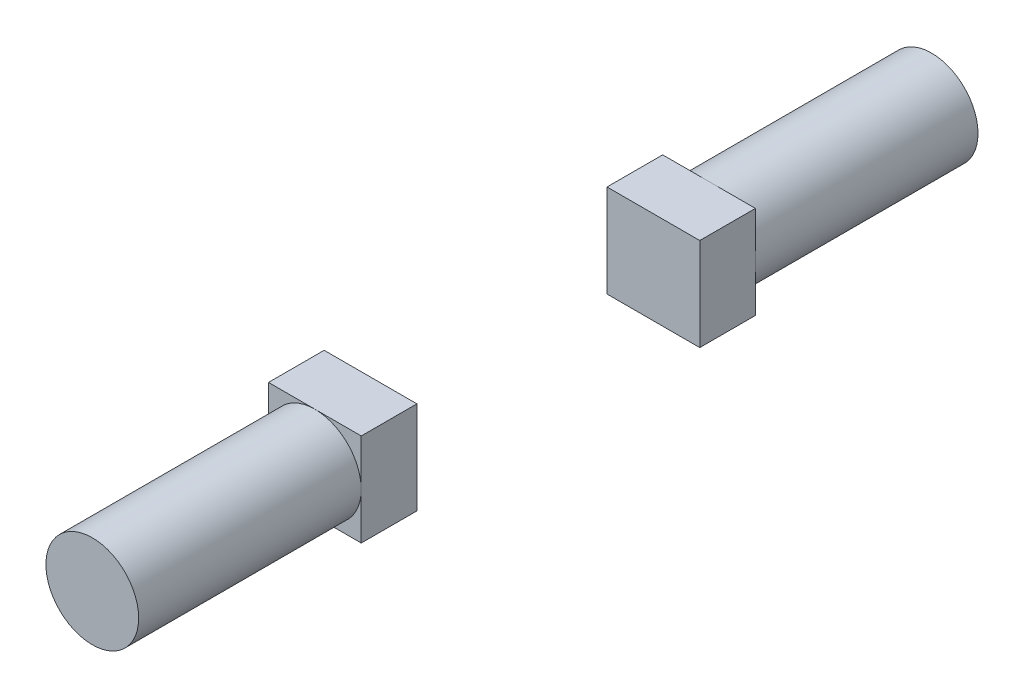
ISO-10303-21;
HEADER;
FILE_DESCRIPTION(('STEP AP214'),'2;1');
FILE_NAME('part.step','',(''),(''),'','','');
FILE_SCHEMA(('AUTOMOTIVE_DESIGN { 1 0 10303 214 1 1 1 1 }'));
ENDSEC;
DATA;
#1=APPLICATION_CONTEXT('core data for automotive mechanical design processes');
#2=APPLICATION_PROTOCOL_DEFINITION('international standard','automotive_design',2000,#1);
#3=PRODUCT_CONTEXT('',#1,'mechanical');
#4=PRODUCT('Part','Part','',(#3));
#5=PRODUCT_RELATED_PRODUCT_CATEGORY('part','',(#4));
#6=PRODUCT_DEFINITION_FORMATION('','',#4);
#7=PRODUCT_DEFINITION_CONTEXT('part definition',#1,'design');
#8=PRODUCT_DEFINITION('design','',#6,#7);
#9=PRODUCT_DEFINITION_SHAPE('','',#8);
#10=(LENGTH_UNIT() NAMED_UNIT(*) SI_UNIT(.MILLI.,.METRE.));
#11=(NAMED_UNIT(*) PLANE_ANGLE_UNIT() SI_UNIT($,.RADIAN.));
#12=(NAMED_UNIT(*) SI_UNIT($,.STERADIAN.) SOLID_ANGLE_UNIT());
#13=UNCERTAINTY_MEASURE_WITH_UNIT(LENGTH_MEASURE(1.E-05),#10,'distance_accuracy_value','');
#14=(GEOMETRIC_REPRESENTATION_CONTEXT(3) GLOBAL_UNCERTAINTY_ASSIGNED_CONTEXT((#13)) GLOBAL_UNIT_ASSIGNED_CONTEXT((#10,
#11,#12)) REPRESENTATION_CONTEXT('',''));
#15=CARTESIAN_POINT('',(0.,0.,0.));
#16=DIRECTION('',(0.,0.,1.));
#17=DIRECTION('',(1.,0.,0.));
#18=AXIS2_PLACEMENT_3D('',#15,#16,#17);
#19=CARTESIAN_POINT('',(5.07999999999999,5.08,21.59));
#20=DIRECTION('',(-1.,0.,0.));
#21=DIRECTION('',(0.,-1.,0.));
#22=AXIS2_PLACEMENT_3D('',#19,#20,#21);
#23=PLANE('',#22);
#24=DIRECTION('',(0.,0.,-1.));
#25=VECTOR('',#24,1.);
#26=CARTESIAN_POINT('',(5.07999999999999,5.08,21.59));
#27=LINE('',#26,#25);
#28=CARTESIAN_POINT('',(5.07999999999999,5.08,-15.494));
#29=VERTEX_POINT('',#28);
#30=CARTESIAN_POINT('',(5.07999999999999,5.08,-21.59));
#31=VERTEX_POINT('',#30);
#32=EDGE_CURVE('E140',#29,#31,#27,.T.);
#33=ORIENTED_EDGE('',*,*,#32,.F.);
#34=DIRECTION('',(0.,1.,0.));
#35=VECTOR('',#34,1.);
#36=CARTESIAN_POINT('',(5.07999999999999,5.08,-15.494));
#37=LINE('',#36,#35);
#38=CARTESIAN_POINT('',(5.08,-5.08,-15.494));
#39=VERTEX_POINT('',#38);
#40=EDGE_CURVE('E63',#39,#29,#37,.T.);
#41=ORIENTED_EDGE('',*,*,#40,.F.);
#42=DIRECTION('',(0.,0.,-1.));
#43=VECTOR('',#42,1.);
#44=CARTESIAN_POINT('',(5.08,-5.08,21.59));
#45=LINE('',#44,#43);
#46=CARTESIAN_POINT('',(5.08,-5.08,-21.59));
#47=VERTEX_POINT('',#46);
#48=EDGE_CURVE('E57',#39,#47,#45,.T.);
#49=ORIENTED_EDGE('',*,*,#48,.T.);
#50=DIRECTION('',(0.,1.,0.));
#51=VECTOR('',#50,1.);
#52=CARTESIAN_POINT('',(5.07999999999999,5.08,-21.59));
#53=LINE('',#52,#51);
#54=CARTESIAN_POINT('',(5.08,0.,-21.59));
#55=VERTEX_POINT('',#54);
#56=EDGE_CURVE('E121',#47,#55,#53,.T.);
#57=ORIENTED_EDGE('',*,*,#56,.T.);
#58=EDGE_CURVE('E126',#55,#31,#53,.T.);
#59=ORIENTED_EDGE('',*,*,#58,.T.);
#60=EDGE_LOOP('',(#33,#41,#49,#57,#59));
#61=FACE_BOUND('',#60,.T.);
#62=ADVANCED_FACE('F54',(#61),#23,.F.);
#63=CARTESIAN_POINT('',(-5.08000000000001,5.08,21.59));
#64=DIRECTION('',(0.,-1.,0.));
#65=DIRECTION('',(0.,0.,-1.));
#66=AXIS2_PLACEMENT_3D('',#63,#64,#65);
#67=PLANE('',#66);
#68=DIRECTION('',(0.,0.,-1.));
#69=VECTOR('',#68,1.);
#70=CARTESIAN_POINT('',(-5.08000000000001,5.08,21.59));
#71=LINE('',#70,#69);
#72=CARTESIAN_POINT('',(-5.08000000000001,5.08,-15.494));
#73=VERTEX_POINT('',#72);
#74=CARTESIAN_POINT('',(-5.08000000000001,5.08,-21.59));
#75=VERTEX_POINT('',#74);
#76=EDGE_CURVE('E146',#73,#75,#71,.T.);
#77=ORIENTED_EDGE('',*,*,#76,.F.);
#78=DIRECTION('',(1.,0.,0.));
#79=VECTOR('',#78,1.);
#80=CARTESIAN_POINT('',(-5.08000000000001,5.08,-15.494));
#81=LINE('',#80,#79);
#82=EDGE_CURVE('E132',#73,#29,#81,.T.);
#83=ORIENTED_EDGE('',*,*,#82,.T.);
#84=ORIENTED_EDGE('',*,*,#32,.T.);
#85=DIRECTION('',(-1.,0.,0.));
#86=VECTOR('',#85,1.);
#87=CARTESIAN_POINT('',(-5.08000000000001,5.08,-21.59));
#88=LINE('',#87,#86);
#89=CARTESIAN_POINT('',(0.,5.08,-21.59));
#90=VERTEX_POINT('',#89);
#91=EDGE_CURVE('E129',#31,#90,#88,.T.);
#92=ORIENTED_EDGE('',*,*,#91,.T.);
#93=EDGE_CURVE('E147',#90,#75,#88,.T.);
#94=ORIENTED_EDGE('',*,*,#93,.T.);
#95=EDGE_LOOP('',(#77,#83,#84,#92,#94));
#96=FACE_BOUND('',#95,.T.);
#97=ADVANCED_FACE('F171',(#96),#67,.F.);
#98=CARTESIAN_POINT('',(-5.08000000000001,5.08,21.59));
#99=DIRECTION('',(1.,0.,0.));
#100=DIRECTION('',(0.,1.,0.));
#101=AXIS2_PLACEMENT_3D('',#98,#99,#100);
#102=PLANE('',#101);
#103=DIRECTION('',(0.,0.,-1.));
#104=VECTOR('',#103,1.);
#105=CARTESIAN_POINT('',(-5.08,-5.08,21.59));
#106=LINE('',#105,#104);
#107=CARTESIAN_POINT('',(-5.08,-5.08,-15.494));
#108=VERTEX_POINT('',#107);
#109=CARTESIAN_POINT('',(-5.08,-5.08,-21.59));
#110=VERTEX_POINT('',#109);
#111=EDGE_CURVE('E150',#108,#110,#106,.T.);
#112=ORIENTED_EDGE('',*,*,#111,.F.);
#113=DIRECTION('',(0.,1.,0.));
#114=VECTOR('',#113,1.);
#115=CARTESIAN_POINT('',(-5.08000000000001,5.08,-15.494));
#116=LINE('',#115,#114);
#117=EDGE_CURVE('E143',#108,#73,#116,.T.);
#118=ORIENTED_EDGE('',*,*,#117,.T.);
#119=ORIENTED_EDGE('',*,*,#76,.T.);
#120=DIRECTION('',(0.,-1.,0.));
#121=VECTOR('',#120,1.);
#122=CARTESIAN_POINT('',(-5.08000000000001,5.08,-21.59));
#123=LINE('',#122,#121);
#124=CARTESIAN_POINT('',(-5.08,0.,-21.59));
#125=VERTEX_POINT('',#124);
#126=EDGE_CURVE('E149',#75,#125,#123,.T.);
#127=ORIENTED_EDGE('',*,*,#126,.T.);
#128=EDGE_CURVE('E152',#125,#110,#123,.T.);
#129=ORIENTED_EDGE('',*,*,#128,.T.);
#130=EDGE_LOOP('',(#112,#118,#119,#127,#129));
#131=FACE_BOUND('',#130,.T.);
#132=ADVANCED_FACE('F162',(#131),#102,.F.);
#133=CARTESIAN_POINT('',(-5.08,-5.08,21.59));
#134=DIRECTION('',(0.,1.,0.));
#135=DIRECTION('',(0.,0.,1.));
#136=AXIS2_PLACEMENT_3D('',#133,#134,#135);
#137=PLANE('',#136);
#138=ORIENTED_EDGE('',*,*,#48,.F.);
#139=DIRECTION('',(1.,0.,0.));
#140=VECTOR('',#139,1.);
#141=CARTESIAN_POINT('',(-5.08000000000001,-5.08,-15.494));
#142=LINE('',#141,#140);
#143=EDGE_CURVE('E12',#108,#39,#142,.T.);
#144=ORIENTED_EDGE('',*,*,#143,.F.);
#145=ORIENTED_EDGE('',*,*,#111,.T.);
#146=DIRECTION('',(1.,0.,0.));
#147=VECTOR('',#146,1.);
#148=CARTESIAN_POINT('',(-5.08,-5.08,-21.59));
#149=LINE('',#148,#147);
#150=CARTESIAN_POINT('',(0.,-5.08,-21.59));
#151=VERTEX_POINT('',#150);
#152=EDGE_CURVE('E151',#110,#151,#149,.T.);
#153=ORIENTED_EDGE('',*,*,#152,.T.);
#154=EDGE_CURVE('E114',#151,#47,#149,.T.);
#155=ORIENTED_EDGE('',*,*,#154,.T.);
#156=EDGE_LOOP('',(#138,#144,#145,#153,#155));
#157=FACE_BOUND('',#156,.T.);
#158=ADVANCED_FACE('F169',(#157),#137,.F.);
#159=CARTESIAN_POINT('',(0.,0.,-21.59));
#160=DIRECTION('',(0.,0.,1.));
#161=DIRECTION('',(1.,0.,0.));
#162=AXIS2_PLACEMENT_3D('',#159,#160,#161);
#163=PLANE('',#162);
#164=ORIENTED_EDGE('',*,*,#58,.F.);
#165=CARTESIAN_POINT('',(0.,0.,-21.59));
#166=DIRECTION('',(0.,0.,1.));
#167=DIRECTION('',(1.,0.,0.));
#168=AXIS2_PLACEMENT_3D('',#165,#166,#167);
#169=CIRCLE('',#168,5.08);
#170=EDGE_CURVE('E106',#55,#90,#169,.T.);
#171=ORIENTED_EDGE('',*,*,#170,.T.);
#172=ORIENTED_EDGE('',*,*,#91,.F.);
#173=EDGE_LOOP('',(#164,#171,#172));
#174=FACE_BOUND('',#173,.T.);
#175=ADVANCED_FACE('F127',(#174),#163,.F.);
#176=ORIENTED_EDGE('',*,*,#93,.F.);
#177=EDGE_CURVE('E85',#90,#125,#169,.T.);
#178=ORIENTED_EDGE('',*,*,#177,.T.);
#179=ORIENTED_EDGE('',*,*,#126,.F.);
#180=EDGE_LOOP('',(#176,#178,#179));
#181=FACE_BOUND('',#180,.T.);
#182=ADVANCED_FACE('F166',(#181),#163,.F.);
#183=ORIENTED_EDGE('',*,*,#128,.F.);
#184=EDGE_CURVE('E90',#125,#151,#169,.T.);
#185=ORIENTED_EDGE('',*,*,#184,.T.);
#186=ORIENTED_EDGE('',*,*,#152,.F.);
#187=EDGE_LOOP('',(#183,#185,#186));
#188=FACE_BOUND('',#187,.T.);
#189=ADVANCED_FACE('F168',(#188),#163,.F.);
#190=ORIENTED_EDGE('',*,*,#154,.F.);
#191=EDGE_CURVE('E109',#151,#55,#169,.T.);
#192=ORIENTED_EDGE('',*,*,#191,.T.);
#193=ORIENTED_EDGE('',*,*,#56,.F.);
#194=EDGE_LOOP('',(#190,#192,#193));
#195=FACE_BOUND('',#194,.T.);
#196=ADVANCED_FACE('F119',(#195),#163,.F.);
#197=CARTESIAN_POINT('',(0.,0.,-45.974));
#198=DIRECTION('',(0.,0.,1.));
#199=DIRECTION('',(1.,0.,0.));
#200=AXIS2_PLACEMENT_3D('',#197,#198,#199);
#201=CYLINDRICAL_SURFACE('',#200,5.08);
#202=CARTESIAN_POINT('',(0.,0.,-45.974));
#203=DIRECTION('',(0.,0.,1.));
#204=DIRECTION('',(1.,0.,0.));
#205=AXIS2_PLACEMENT_3D('',#202,#203,#204);
#206=CIRCLE('',#205,5.08);
#207=CARTESIAN_POINT('',(5.08,0.,-45.974));
#208=VERTEX_POINT('',#207);
#209=EDGE_CURVE('E124',#208,#208,#206,.T.);
#210=ORIENTED_EDGE('',*,*,#209,.T.);
#211=EDGE_LOOP('',(#210));
#212=FACE_BOUND('',#211,.T.);
#213=ORIENTED_EDGE('',*,*,#170,.F.);
#214=ORIENTED_EDGE('',*,*,#191,.F.);
#215=ORIENTED_EDGE('',*,*,#184,.F.);
#216=ORIENTED_EDGE('',*,*,#177,.F.);
#217=EDGE_LOOP('',(#213,#214,#215,#216));
#218=FACE_BOUND('',#217,.T.);
#219=ADVANCED_FACE('F108',(#212,#218),#201,.T.);
#220=CARTESIAN_POINT('',(0.,0.,-45.974));
#221=DIRECTION('',(0.,0.,-1.));
#222=DIRECTION('',(1.,0.,0.));
#223=AXIS2_PLACEMENT_3D('',#220,#221,#222);
#224=PLANE('',#223);
#225=ORIENTED_EDGE('',*,*,#209,.F.);
#226=EDGE_LOOP('',(#225));
#227=FACE_BOUND('',#226,.T.);
#228=ADVANCED_FACE('F174',(#227),#224,.T.);
#229=CARTESIAN_POINT('',(-5.08000000000001,5.08,-15.494));
#230=DIRECTION('',(0.,0.,-1.));
#231=DIRECTION('',(-1.,0.,0.));
#232=AXIS2_PLACEMENT_3D('',#229,#230,#231);
#233=PLANE('',#232);
#234=ORIENTED_EDGE('',*,*,#40,.T.);
#235=ORIENTED_EDGE('',*,*,#82,.F.);
#236=ORIENTED_EDGE('',*,*,#117,.F.);
#237=ORIENTED_EDGE('',*,*,#143,.T.);
#238=EDGE_LOOP('',(#234,#235,#236,#237));
#239=FACE_BOUND('',#238,.T.);
#240=ADVANCED_FACE('F172',(#239),#233,.F.);
#241=CLOSED_SHELL('',(#62,#97,#132,#158,#175,#182,#189,#196,#219,#228,#240));
#242=MANIFOLD_SOLID_BREP('B2',#241);
#243=CARTESIAN_POINT('',(0.,0.,45.974));
#244=DIRECTION('',(0.,0.,1.));
#245=DIRECTION('',(1.,0.,0.));
#246=AXIS2_PLACEMENT_3D('',#243,#244,#245);
#247=PLANE('',#246);
#248=CARTESIAN_POINT('',(0.,0.,45.974));
#249=DIRECTION('',(0.,0.,1.));
#250=DIRECTION('',(1.,0.,0.));
#251=AXIS2_PLACEMENT_3D('',#248,#249,#250);
#252=CIRCLE('',#251,5.08);
#253=CARTESIAN_POINT('',(5.08,0.,45.974));
#254=VERTEX_POINT('',#253);
#255=EDGE_CURVE('E372',#254,#254,#252,.T.);
#256=ORIENTED_EDGE('',*,*,#255,.T.);
#257=EDGE_LOOP('',(#256));
#258=FACE_BOUND('',#257,.T.);
#259=ADVANCED_FACE('F262',(#258),#247,.T.);
#260=CARTESIAN_POINT('',(0.,0.,45.974));
#261=DIRECTION('',(0.,0.,-1.));
#262=DIRECTION('',(-1.,0.,0.));
#263=AXIS2_PLACEMENT_3D('',#260,#261,#262);
#264=CYLINDRICAL_SURFACE('',#263,5.08);
#265=ORIENTED_EDGE('',*,*,#255,.F.);
#266=EDGE_LOOP('',(#265));
#267=FACE_BOUND('',#266,.T.);
#268=CARTESIAN_POINT('',(0.,0.,21.59));
#269=DIRECTION('',(0.,0.,1.));
#270=DIRECTION('',(1.,0.,0.));
#271=AXIS2_PLACEMENT_3D('',#268,#269,#270);
#272=CIRCLE('',#271,5.08);
#273=CARTESIAN_POINT('',(5.08,0.,21.59));
#274=VERTEX_POINT('',#273);
#275=CARTESIAN_POINT('',(0.,5.08,21.59));
#276=VERTEX_POINT('',#275);
#277=EDGE_CURVE('E274',#274,#276,#272,.T.);
#278=ORIENTED_EDGE('',*,*,#277,.T.);
#279=CARTESIAN_POINT('',(-5.08,0.,21.59));
#280=VERTEX_POINT('',#279);
#281=EDGE_CURVE('E52',#276,#280,#272,.T.);
#282=ORIENTED_EDGE('',*,*,#281,.T.);
#283=CARTESIAN_POINT('',(0.,-5.08,21.59));
#284=VERTEX_POINT('',#283);
#285=EDGE_CURVE('E272',#280,#284,#272,.T.);
#286=ORIENTED_EDGE('',*,*,#285,.T.);
#287=EDGE_CURVE('E289',#284,#274,#272,.T.);
#288=ORIENTED_EDGE('',*,*,#287,.T.);
#289=EDGE_LOOP('',(#278,#282,#286,#288));
#290=FACE_BOUND('',#289,.T.);
#291=ADVANCED_FACE('F396',(#267,#290),#264,.T.);
#292=CARTESIAN_POINT('',(0.,0.,21.59));
#293=DIRECTION('',(0.,0.,1.));
#294=DIRECTION('',(1.,0.,0.));
#295=AXIS2_PLACEMENT_3D('',#292,#293,#294);
#296=PLANE('',#295);
#297=ORIENTED_EDGE('',*,*,#277,.F.);
#298=DIRECTION('',(0.,1.,0.));
#299=VECTOR('',#298,1.);
#300=CARTESIAN_POINT('',(5.07999999999999,5.08,21.59));
#301=LINE('',#300,#299);
#302=CARTESIAN_POINT('',(5.07999999999999,5.08,21.59));
#303=VERTEX_POINT('',#302);
#304=EDGE_CURVE('E368',#274,#303,#301,.T.);
#305=ORIENTED_EDGE('',*,*,#304,.T.);
#306=DIRECTION('',(-1.,0.,0.));
#307=VECTOR('',#306,1.);
#308=CARTESIAN_POINT('',(-5.08000000000001,5.08,21.59));
#309=LINE('',#308,#307);
#310=EDGE_CURVE('E361',#303,#276,#309,.T.);
#311=ORIENTED_EDGE('',*,*,#310,.T.);
#312=EDGE_LOOP('',(#297,#305,#311));
#313=FACE_BOUND('',#312,.T.);
#314=ADVANCED_FACE('F393',(#313),#296,.T.);
#315=ORIENTED_EDGE('',*,*,#281,.F.);
#316=CARTESIAN_POINT('',(-5.08000000000001,5.08,21.59));
#317=VERTEX_POINT('',#316);
#318=EDGE_CURVE('E365',#276,#317,#309,.T.);
#319=ORIENTED_EDGE('',*,*,#318,.T.);
#320=DIRECTION('',(0.,-1.,0.));
#321=VECTOR('',#320,1.);
#322=CARTESIAN_POINT('',(-5.08000000000001,5.08,21.59));
#323=LINE('',#322,#321);
#324=EDGE_CURVE('E342',#317,#280,#323,.T.);
#325=ORIENTED_EDGE('',*,*,#324,.T.);
#326=EDGE_LOOP('',(#315,#319,#325));
#327=FACE_BOUND('',#326,.T.);
#328=ADVANCED_FACE('F402',(#327),#296,.T.);
#329=ORIENTED_EDGE('',*,*,#285,.F.);
#330=CARTESIAN_POINT('',(-5.08,-5.08,21.59));
#331=VERTEX_POINT('',#330);
#332=EDGE_CURVE('E360',#280,#331,#323,.T.);
#333=ORIENTED_EDGE('',*,*,#332,.T.);
#334=DIRECTION('',(1.,0.,0.));
#335=VECTOR('',#334,1.);
#336=CARTESIAN_POINT('',(-5.08,-5.08,21.59));
#337=LINE('',#336,#335);
#338=EDGE_CURVE('E353',#331,#284,#337,.T.);
#339=ORIENTED_EDGE('',*,*,#338,.T.);
#340=EDGE_LOOP('',(#329,#333,#339));
#341=FACE_BOUND('',#340,.T.);
#342=ADVANCED_FACE('F400',(#341),#296,.T.);
#343=ORIENTED_EDGE('',*,*,#287,.F.);
#344=CARTESIAN_POINT('',(5.08,-5.08,21.59));
#345=VERTEX_POINT('',#344);
#346=EDGE_CURVE('E357',#284,#345,#337,.T.);
#347=ORIENTED_EDGE('',*,*,#346,.T.);
#348=EDGE_CURVE('E366',#345,#274,#301,.T.);
#349=ORIENTED_EDGE('',*,*,#348,.T.);
#350=EDGE_LOOP('',(#343,#347,#349));
#351=FACE_BOUND('',#350,.T.);
#352=ADVANCED_FACE('F384',(#351),#296,.T.);
#353=CARTESIAN_POINT('',(-5.08,-5.08,21.59));
#354=DIRECTION('',(0.,1.,0.));
#355=DIRECTION('',(0.,0.,1.));
#356=AXIS2_PLACEMENT_3D('',#353,#354,#355);
#357=PLANE('',#356);
#358=DIRECTION('',(0.,0.,-1.));
#359=VECTOR('',#358,1.);
#360=CARTESIAN_POINT('',(-5.08,-5.08,21.59));
#361=LINE('',#360,#359);
#362=CARTESIAN_POINT('',(-5.08000000000001,-5.08,15.494));
#363=VERTEX_POINT('',#362);
#364=EDGE_CURVE('E344',#331,#363,#361,.T.);
#365=ORIENTED_EDGE('',*,*,#364,.T.);
#366=DIRECTION('',(1.,0.,0.));
#367=VECTOR('',#366,1.);
#368=CARTESIAN_POINT('',(-5.08000000000001,-5.08,15.494));
#369=LINE('',#368,#367);
#370=CARTESIAN_POINT('',(5.08,-5.08,15.494));
#371=VERTEX_POINT('',#370);
#372=EDGE_CURVE('E321',#363,#371,#369,.T.);
#373=ORIENTED_EDGE('',*,*,#372,.T.);
#374=DIRECTION('',(0.,0.,-1.));
#375=VECTOR('',#374,1.);
#376=CARTESIAN_POINT('',(5.08,-5.08,21.59));
#377=LINE('',#376,#375);
#378=EDGE_CURVE('E347',#345,#371,#377,.T.);
#379=ORIENTED_EDGE('',*,*,#378,.F.);
#380=ORIENTED_EDGE('',*,*,#346,.F.);
#381=ORIENTED_EDGE('',*,*,#338,.F.);
#382=EDGE_LOOP('',(#365,#373,#379,#380,#381));
#383=FACE_BOUND('',#382,.T.);
#384=ADVANCED_FACE('F389',(#383),#357,.F.);
#385=CARTESIAN_POINT('',(-5.08000000000001,5.08,21.59));
#386=DIRECTION('',(1.,0.,0.));
#387=DIRECTION('',(0.,1.,0.));
#388=AXIS2_PLACEMENT_3D('',#385,#386,#387);
#389=PLANE('',#388);
#390=DIRECTION('',(0.,0.,-1.));
#391=VECTOR('',#390,1.);
#392=CARTESIAN_POINT('',(-5.08000000000001,5.08,21.59));
#393=LINE('',#392,#391);
#394=CARTESIAN_POINT('',(-5.08000000000001,5.08,15.494));
#395=VERTEX_POINT('',#394);
#396=EDGE_CURVE('E333',#317,#395,#393,.T.);
#397=ORIENTED_EDGE('',*,*,#396,.T.);
#398=DIRECTION('',(0.,-1.,0.));
#399=VECTOR('',#398,1.);
#400=CARTESIAN_POINT('',(-5.08000000000001,5.08,15.494));
#401=LINE('',#400,#399);
#402=EDGE_CURVE('E317',#395,#363,#401,.T.);
#403=ORIENTED_EDGE('',*,*,#402,.T.);
#404=ORIENTED_EDGE('',*,*,#364,.F.);
#405=ORIENTED_EDGE('',*,*,#332,.F.);
#406=ORIENTED_EDGE('',*,*,#324,.F.);
#407=EDGE_LOOP('',(#397,#403,#404,#405,#406));
#408=FACE_BOUND('',#407,.T.);
#409=ADVANCED_FACE('F339',(#408),#389,.F.);
#410=CARTESIAN_POINT('',(-5.08000000000001,5.08,21.59));
#411=DIRECTION('',(0.,-1.,0.));
#412=DIRECTION('',(0.,0.,-1.));
#413=AXIS2_PLACEMENT_3D('',#410,#411,#412);
#414=PLANE('',#413);
#415=DIRECTION('',(0.,0.,-1.));
#416=VECTOR('',#415,1.);
#417=CARTESIAN_POINT('',(5.07999999999999,5.08,21.59));
#418=LINE('',#417,#416);
#419=CARTESIAN_POINT('',(5.07999999999999,5.08,15.494));
#420=VERTEX_POINT('',#419);
#421=EDGE_CURVE('E266',#303,#420,#418,.T.);
#422=ORIENTED_EDGE('',*,*,#421,.T.);
#423=DIRECTION('',(1.,0.,0.));
#424=VECTOR('',#423,1.);
#425=CARTESIAN_POINT('',(-5.08000000000001,5.08,15.494));
#426=LINE('',#425,#424);
#427=EDGE_CURVE('E320',#395,#420,#426,.T.);
#428=ORIENTED_EDGE('',*,*,#427,.F.);
#429=ORIENTED_EDGE('',*,*,#396,.F.);
#430=ORIENTED_EDGE('',*,*,#318,.F.);
#431=ORIENTED_EDGE('',*,*,#310,.F.);
#432=EDGE_LOOP('',(#422,#428,#429,#430,#431));
#433=FACE_BOUND('',#432,.T.);
#434=ADVANCED_FACE('F331',(#433),#414,.F.);
#435=CARTESIAN_POINT('',(5.07999999999999,5.08,21.59));
#436=DIRECTION('',(-1.,0.,0.));
#437=DIRECTION('',(0.,-1.,0.));
#438=AXIS2_PLACEMENT_3D('',#435,#436,#437);
#439=PLANE('',#438);
#440=ORIENTED_EDGE('',*,*,#378,.T.);
#441=DIRECTION('',(0.,-1.,0.));
#442=VECTOR('',#441,1.);
#443=CARTESIAN_POINT('',(5.07999999999999,5.08,15.494));
#444=LINE('',#443,#442);
#445=EDGE_CURVE('E281',#420,#371,#444,.T.);
#446=ORIENTED_EDGE('',*,*,#445,.F.);
#447=ORIENTED_EDGE('',*,*,#421,.F.);
#448=ORIENTED_EDGE('',*,*,#304,.F.);
#449=ORIENTED_EDGE('',*,*,#348,.F.);
#450=EDGE_LOOP('',(#440,#446,#447,#448,#449));
#451=FACE_BOUND('',#450,.T.);
#452=ADVANCED_FACE('F264',(#451),#439,.F.);
#453=CARTESIAN_POINT('',(-5.08000000000001,5.08,15.494));
#454=DIRECTION('',(0.,0.,1.));
#455=DIRECTION('',(1.,0.,0.));
#456=AXIS2_PLACEMENT_3D('',#453,#454,#455);
#457=PLANE('',#456);
#458=ORIENTED_EDGE('',*,*,#445,.T.);
#459=ORIENTED_EDGE('',*,*,#372,.F.);
#460=ORIENTED_EDGE('',*,*,#402,.F.);
#461=ORIENTED_EDGE('',*,*,#427,.T.);
#462=EDGE_LOOP('',(#458,#459,#460,#461));
#463=FACE_BOUND('',#462,.T.);
#464=ADVANCED_FACE('F319',(#463),#457,.F.);
#465=CLOSED_SHELL('',(#259,#291,#314,#328,#342,#352,#384,#409,#434,#452,#464));
#466=MANIFOLD_SOLID_BREP('B6',#465);
#467=ADVANCED_BREP_SHAPE_REPRESENTATION('',(#18,#242,#466),#14);
#468=SHAPE_DEFINITION_REPRESENTATION(#9,#467);
ENDSEC;
END-ISO-10303-21;
